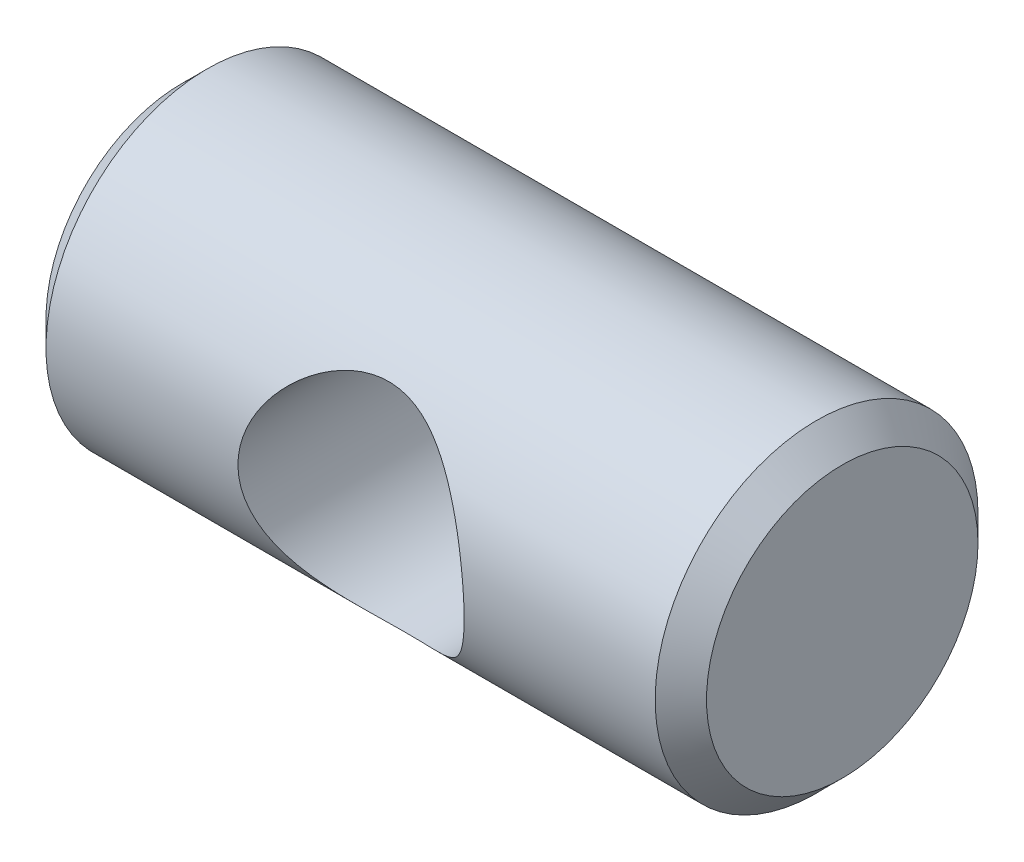
ISO-10303-21;
HEADER;
FILE_DESCRIPTION(('STEP AP214'),'2;1');
FILE_NAME('part.step','',(''),(''),'','','');
FILE_SCHEMA(('AUTOMOTIVE_DESIGN { 1 0 10303 214 1 1 1 1 }'));
ENDSEC;
DATA;
#1=APPLICATION_CONTEXT('core data for automotive mechanical design processes');
#2=APPLICATION_PROTOCOL_DEFINITION('international standard','automotive_design',2000,#1);
#3=PRODUCT_CONTEXT('',#1,'mechanical');
#4=PRODUCT('Part','Part','',(#3));
#5=PRODUCT_RELATED_PRODUCT_CATEGORY('part','',(#4));
#6=PRODUCT_DEFINITION_FORMATION('','',#4);
#7=PRODUCT_DEFINITION_CONTEXT('part definition',#1,'design');
#8=PRODUCT_DEFINITION('design','',#6,#7);
#9=PRODUCT_DEFINITION_SHAPE('','',#8);
#10=(LENGTH_UNIT() NAMED_UNIT(*) SI_UNIT(.MILLI.,.METRE.));
#11=(NAMED_UNIT(*) PLANE_ANGLE_UNIT() SI_UNIT($,.RADIAN.));
#12=(NAMED_UNIT(*) SI_UNIT($,.STERADIAN.) SOLID_ANGLE_UNIT());
#13=UNCERTAINTY_MEASURE_WITH_UNIT(LENGTH_MEASURE(1.E-05),#10,'distance_accuracy_value','');
#14=(GEOMETRIC_REPRESENTATION_CONTEXT(3) GLOBAL_UNCERTAINTY_ASSIGNED_CONTEXT((#13)) GLOBAL_UNIT_ASSIGNED_CONTEXT((#10,
#11,#12)) REPRESENTATION_CONTEXT('',''));
#15=CARTESIAN_POINT('',(0.,0.,0.));
#16=DIRECTION('',(0.,0.,1.));
#17=DIRECTION('',(1.,0.,0.));
#18=AXIS2_PLACEMENT_3D('',#15,#16,#17);
#19=CARTESIAN_POINT('',(9.78,0.,0.));
#20=DIRECTION('',(-1.,0.,0.));
#21=DIRECTION('',(0.,0.,1.));
#22=AXIS2_PLACEMENT_3D('',#19,#20,#21);
#23=CYLINDRICAL_SURFACE('',#22,4.78);
#24=CARTESIAN_POINT('',(9.01999999999999,0.,0.));
#25=DIRECTION('',(1.,0.,0.));
#26=DIRECTION('',(0.,0.,-1.));
#27=AXIS2_PLACEMENT_3D('',#24,#25,#26);
#28=CIRCLE('',#27,4.78);
#29=CARTESIAN_POINT('',(9.01999999999999,0.,-4.78));
#30=VERTEX_POINT('',#29);
#31=EDGE_CURVE('E46',#30,#30,#28,.F.);
#32=ORIENTED_EDGE('',*,*,#31,.T.);
#33=EDGE_LOOP('',(#32));
#34=FACE_BOUND('',#33,.T.);
#35=CARTESIAN_POINT('',(-9.02,0.,0.));
#36=DIRECTION('',(1.,0.,0.));
#37=DIRECTION('',(0.,0.,-1.));
#38=AXIS2_PLACEMENT_3D('',#35,#36,#37);
#39=CIRCLE('',#38,4.78);
#40=CARTESIAN_POINT('',(-9.02,0.,-4.78));
#41=VERTEX_POINT('',#40);
#42=EDGE_CURVE('E50',#41,#41,#39,.T.);
#43=ORIENTED_EDGE('',*,*,#42,.T.);
#44=EDGE_LOOP('',(#43));
#45=FACE_BOUND('',#44,.T.);
#46=CARTESIAN_POINT('',(-3.33063057092797,0.,-4.78));
#47=CARTESIAN_POINT('',(-3.33676539125167,-0.0817358571244511,-4.77999966649218));
#48=CARTESIAN_POINT('',(-3.33988802539212,-0.163703701049211,-4.77789885423811));
#49=CARTESIAN_POINT('',(-3.34010613153016,-0.327460768762198,-4.76947552132057));
#50=CARTESIAN_POINT('',(-3.33719898946377,-0.409249899685928,-4.76315117044975));
#51=CARTESIAN_POINT('',(-3.32543727495204,-0.572079528417738,-4.74634895090865));
#52=CARTESIAN_POINT('',(-3.31657497758107,-0.653118915073797,-4.73586569462154));
#53=CARTESIAN_POINT('',(-3.29308213176358,-0.813748659945501,-4.71092738722702));
#54=CARTESIAN_POINT('',(-3.27844914079353,-0.893338389631405,-4.69647065507882));
#55=CARTESIAN_POINT('',(-3.22643073348291,-1.12824247764658,-4.647672929024));
#56=CARTESIAN_POINT('',(-3.18084916567647,-1.2806904872149,-4.60779720472608));
#57=CARTESIAN_POINT('',(-3.07028481662123,-1.57424559019182,-4.51595969619237));
#58=CARTESIAN_POINT('',(-3.0053029126639,-1.71535319605217,-4.46399845849211));
#59=CARTESIAN_POINT('',(-2.8526700268856,-1.99505131544502,-4.34659893579363));
#60=CARTESIAN_POINT('',(-2.76364014223547,-2.13257506301559,-4.28042297967634));
#61=CARTESIAN_POINT('',(-2.5684551498314,-2.3912489751205,-4.14148987724878));
#62=CARTESIAN_POINT('',(-2.46228144838001,-2.51238109657793,-4.06872562352629));
#63=CARTESIAN_POINT('',(-2.21209856597161,-2.75978683966693,-3.90614354526028));
#64=CARTESIAN_POINT('',(-2.06475822393992,-2.88235195387562,-3.81579563949052));
#65=CARTESIAN_POINT('',(-1.74938343570631,-3.10169066112947,-3.63972808628516));
#66=CARTESIAN_POINT('',(-1.58135560321701,-3.1984724658577,-3.55400697222272));
#67=CARTESIAN_POINT('',(-1.27574248655582,-3.33994877544649,-3.42049304389891));
#68=CARTESIAN_POINT('',(-1.14309111475024,-3.39162881998858,-3.36884701872389));
#69=CARTESIAN_POINT('',(-0.868171214232621,-3.47839663166315,-3.27918654249491));
#70=CARTESIAN_POINT('',(-0.725925863936218,-3.51352285856917,-3.24114054446644));
#71=CARTESIAN_POINT('',(-0.456778401189836,-3.56098397003318,-3.18886561110929));
#72=CARTESIAN_POINT('',(-0.330905440225495,-3.57600341619245,-3.17186331778383));
#73=CARTESIAN_POINT('',(-0.0771522552904866,-3.59152153452207,-3.15428764860724));
#74=CARTESIAN_POINT('',(0.0507263323938594,-3.59203148454257,-3.15370151291364));
#75=CARTESIAN_POINT('',(0.304456273965372,-3.57851911488008,-3.16901974936269));
#76=CARTESIAN_POINT('',(0.430310477029117,-3.56451944553301,-3.18489841903175));
#77=CARTESIAN_POINT('',(0.677189681607818,-3.5230327215385,-3.23072346885153));
#78=CARTESIAN_POINT('',(0.798206706630149,-3.49552430904085,-3.26069212261029));
#79=CARTESIAN_POINT('',(1.08540616898222,-3.4136347105578,-3.34669387518232));
#80=CARTESIAN_POINT('',(1.24801209966346,-3.3527542502823,-3.4083932928103));
#81=CARTESIAN_POINT('',(1.55792869359016,-3.20934907091944,-3.54375745558097));
#82=CARTESIAN_POINT('',(1.7052093520615,-3.12678296760159,-3.61744497501507));
#83=CARTESIAN_POINT('',(1.98910473933941,-2.93868886474521,-3.77198471339833));
#84=CARTESIAN_POINT('',(2.12516086495379,-2.83245435836602,-3.85299789142044));
#85=CARTESIAN_POINT('',(2.37990031408984,-2.59976864472572,-4.0136756902919));
#86=CARTESIAN_POINT('',(2.49857675321568,-2.47330946739396,-4.09333976574748));
#87=CARTESIAN_POINT('',(2.67260294801087,-2.25590151469892,-4.21521400085458));
#88=CARTESIAN_POINT('',(2.73422627021433,-2.17112452936343,-4.25960231447671));
#89=CARTESIAN_POINT('',(2.84989416447087,-1.9949358869096,-4.34490468006992));
#90=CARTESIAN_POINT('',(2.90394239840893,-1.90352746816202,-4.38582040692994));
#91=CARTESIAN_POINT('',(3.00366613801331,-1.71457474641946,-4.46307423584665));
#92=CARTESIAN_POINT('',(3.0493529108607,-1.61703894195848,-4.4994184770652));
#93=CARTESIAN_POINT('',(3.13158315679104,-1.41642298219572,-4.5665458260388));
#94=CARTESIAN_POINT('',(3.16813138282885,-1.31334574302932,-4.59733182230953));
#95=CARTESIAN_POINT('',(3.24394962180977,-1.06003125309359,-4.66347569287104));
#96=CARTESIAN_POINT('',(3.27842046935922,-0.907475950560133,-4.69570617232902));
#97=CARTESIAN_POINT('',(3.32565961796539,-0.596778113212414,-4.74520584581533));
#98=CARTESIAN_POINT('',(3.338446274403,-0.438640419702783,-4.76248768758954));
#99=CARTESIAN_POINT('',(3.34128849208833,-0.120886806893837,-4.7811242764666));
#100=CARTESIAN_POINT('',(3.33129991792253,0.0387313845776097,-4.78244806771143));
#101=CARTESIAN_POINT('',(3.28873988258478,0.354282081348732,-4.7694700869775));
#102=CARTESIAN_POINT('',(3.25616176280358,0.510213485894268,-4.75516370705414));
#103=CARTESIAN_POINT('',(3.17086453501599,0.810704954450435,-4.71314049829326));
#104=CARTESIAN_POINT('',(3.1186042550631,0.955439708476959,-4.68572559661454));
#105=CARTESIAN_POINT('',(2.99593886064011,1.23431167329955,-4.62011068482161));
#106=CARTESIAN_POINT('',(2.92553031538523,1.36844687406345,-4.58190863535263));
#107=CARTESIAN_POINT('',(2.76002097373168,1.63828679943511,-4.492967209277));
#108=CARTESIAN_POINT('',(2.66305574100992,1.77254043082908,-4.44131086725188));
#109=CARTESIAN_POINT('',(2.45171752361612,2.02414370296862,-4.33244486650996));
#110=CARTESIAN_POINT('',(2.3373245604925,2.14147363865188,-4.27522886203756));
#111=CARTESIAN_POINT('',(2.07299005839493,2.37572113568635,-4.15026480188048));
#112=CARTESIAN_POINT('',(1.92029399278101,2.48944143866722,-4.08232286530849));
#113=CARTESIAN_POINT('',(1.5958110081242,2.6902949710491,-3.95284550398233));
#114=CARTESIAN_POINT('',(1.42403601749138,2.7774446865133,-3.89130612236076));
#115=CARTESIAN_POINT('',(1.10291786857647,2.90629975005956,-3.79563172198653));
#116=CARTESIAN_POINT('',(0.956810766472338,2.95376492454212,-3.75844758867047));
#117=CARTESIAN_POINT('',(0.656746344994096,3.02842866265348,-3.69855983762439));
#118=CARTESIAN_POINT('',(0.502803284869111,3.05566272514491,-3.67583086603468));
#119=CARTESIAN_POINT('',(0.189971842970665,3.0883167381648,-3.64845182308364));
#120=CARTESIAN_POINT('',(0.0310589379063212,3.09360199426155,-3.64391338848103));
#121=CARTESIAN_POINT('',(-0.285320807227747,3.08155724848054,-3.65410060934482));
#122=CARTESIAN_POINT('',(-0.442786963320062,3.06421705346061,-3.66883494752337));
#123=CARTESIAN_POINT('',(-0.738261126757475,3.01055950683524,-3.71294731262674));
#124=CARTESIAN_POINT('',(-0.876794901379663,2.97595113702564,-3.74099713164187));
#125=CARTESIAN_POINT('',(-1.14605004225745,2.89040561941312,-3.80747678017108));
#126=CARTESIAN_POINT('',(-1.27676821176829,2.83946184356998,-3.84591082205324));
#127=CARTESIAN_POINT('',(-1.54991112838108,2.71304301772115,-3.93633973232228));
#128=CARTESIAN_POINT('',(-1.69070272193468,2.63490579658652,-3.98952593455585));
#129=CARTESIAN_POINT('',(-1.95874606705629,2.46008514214848,-4.09964382375276));
#130=CARTESIAN_POINT('',(-2.08598297013024,2.36338168877894,-4.15657950986317));
#131=CARTESIAN_POINT('',(-2.35108322428361,2.13021246005196,-4.28153903185377));
#132=CARTESIAN_POINT('',(-2.48549057542721,1.989663038697,-4.34935756817831));
#133=CARTESIAN_POINT('',(-2.72941983025129,1.68491592342699,-4.47623416677492));
#134=CARTESIAN_POINT('',(-2.83895382859404,1.52072978659437,-4.5352964818867));
#135=CARTESIAN_POINT('',(-3.01103475904863,1.20439767138347,-4.62813420989487));
#136=CARTESIAN_POINT('',(-3.07854051609877,1.05576260710862,-4.66457427100285));
#137=CARTESIAN_POINT('',(-3.16330947156953,0.82507814344574,-4.70890599331024));
#138=CARTESIAN_POINT('',(-3.1888041083791,0.746958270624455,-4.72195570943659));
#139=CARTESIAN_POINT('',(-3.23406573379647,0.588564271004288,-4.74429907021986));
#140=CARTESIAN_POINT('',(-3.25383526621185,0.508291118338657,-4.75359438377901));
#141=CARTESIAN_POINT('',(-3.28517308849838,0.356952498058561,-4.76717604384205));
#142=CARTESIAN_POINT('',(-3.29748287716603,0.286084166525628,-4.77196453484361));
#143=CARTESIAN_POINT('',(-3.31751555245762,0.143537141372693,-4.77837710995417));
#144=CARTESIAN_POINT('',(-3.3252371328246,0.0718582228926744,-4.78000029320399));
#145=CARTESIAN_POINT('',(-3.33063057092797,0.,-4.78));
#146=B_SPLINE_CURVE_WITH_KNOTS('',3,(#46,#47,#48,#49,#50,#51,#52,#53,#54,#55,#56,#57,#58,#59,
#60,#61,#62,#63,#64,#65,#66,#67,#68,#69,#70,#71,#72,#73,#74,#75,#76,#77,#78,#79,#80,#81,#82,#83,
#84,#85,#86,#87,#88,#89,#90,#91,#92,#93,#94,#95,#96,#97,#98,#99,#100,#101,#102,#103,#104,#105,
#106,#107,#108,#109,#110,#111,#112,#113,#114,#115,#116,#117,#118,#119,#120,#121,#122,#123,#124,
#125,#126,#127,#128,#129,#130,#131,#132,#133,#134,#135,#136,#137,#138,#139,#140,#141,#142,#143,
#144,#145),.UNSPECIFIED.,.T.,.F.,(4,2,2,2,2,2,2,2,2,2,2,2,2,2,2,2,2,2,2,2,2,2,2,2,2,2,2,2,2,2,2,
2,2,2,2,2,2,2,2,2,2,2,2,2,2,2,2,2,2,4),(0.,0.245824100276611,0.491754793935409,
0.738005122109381,0.984359791100692,1.47408641984102,1.96379090628794,2.49192992683938,
3.0206456477113,3.65377088568753,4.28669423894782,4.73960333216678,5.1914549220684,
5.57342837523144,5.95510492234758,6.3361865469179,6.71787262567725,7.26762740616682,
7.81843904291118,8.3886569429409,8.9591001087531,9.30013321817021,9.64100089539176,
9.98140581147174,10.3216333130821,10.7984660737602,11.2748949999681,11.7522479675101,
12.2297417018871,12.6967314925483,13.1638096287332,13.6822781424451,14.2013455431729,
14.8051912989707,15.4086616248264,15.8810047798169,16.3525171594496,16.8269188572968,
17.3015343548139,17.7364437600122,18.1715298521164,18.6784872655248,19.1859944356092,
19.8009790838485,20.4156640525465,20.9151418307943,21.164494138307,21.4137354817391,
21.6297906916855,21.8459073828357),.UNSPECIFIED.);
#147=CARTESIAN_POINT('',(-3.33063057092797,0.,-4.78));
#148=VERTEX_POINT('',#147);
#149=EDGE_CURVE('E59',#148,#148,#146,.T.);
#150=ORIENTED_EDGE('',*,*,#149,.T.);
#151=EDGE_LOOP('',(#150));
#152=FACE_BOUND('',#151,.T.);
#153=CARTESIAN_POINT('',(3.33063057092797,0.,4.78));
#154=CARTESIAN_POINT('',(3.33676539125167,-0.0817358571244511,4.77999966649218));
#155=CARTESIAN_POINT('',(3.33988802539212,-0.163703701049211,4.77789885423811));
#156=CARTESIAN_POINT('',(3.34010613153016,-0.327460768762198,4.76947552132057));
#157=CARTESIAN_POINT('',(3.33719898946377,-0.409249899685928,4.76315117044975));
#158=CARTESIAN_POINT('',(3.32543727495204,-0.572079528417738,4.74634895090865));
#159=CARTESIAN_POINT('',(3.31657497758107,-0.653118915073797,4.73586569462154));
#160=CARTESIAN_POINT('',(3.29308213176358,-0.813748659945501,4.71092738722702));
#161=CARTESIAN_POINT('',(3.27844914079353,-0.893338389631405,4.69647065507882));
#162=CARTESIAN_POINT('',(3.22643073348291,-1.12824247764658,4.647672929024));
#163=CARTESIAN_POINT('',(3.18084916567647,-1.2806904872149,4.60779720472608));
#164=CARTESIAN_POINT('',(3.07028481662123,-1.57424559019182,4.51595969619237));
#165=CARTESIAN_POINT('',(3.0053029126639,-1.71535319605217,4.46399845849211));
#166=CARTESIAN_POINT('',(2.8526700268856,-1.99505131544502,4.34659893579363));
#167=CARTESIAN_POINT('',(2.76364014223547,-2.13257506301559,4.28042297967634));
#168=CARTESIAN_POINT('',(2.5684551498314,-2.3912489751205,4.14148987724878));
#169=CARTESIAN_POINT('',(2.46228144838001,-2.51238109657793,4.06872562352629));
#170=CARTESIAN_POINT('',(2.21209856597161,-2.75978683966693,3.90614354526028));
#171=CARTESIAN_POINT('',(2.06475822393992,-2.88235195387562,3.81579563949052));
#172=CARTESIAN_POINT('',(1.74938343570631,-3.10169066112947,3.63972808628516));
#173=CARTESIAN_POINT('',(1.58135560321701,-3.1984724658577,3.55400697222272));
#174=CARTESIAN_POINT('',(1.27574248655582,-3.33994877544649,3.42049304389891));
#175=CARTESIAN_POINT('',(1.14309111475024,-3.39162881998858,3.36884701872389));
#176=CARTESIAN_POINT('',(0.868171214232621,-3.47839663166315,3.27918654249491));
#177=CARTESIAN_POINT('',(0.725925863936218,-3.51352285856917,3.24114054446644));
#178=CARTESIAN_POINT('',(0.456778401189836,-3.56098397003318,3.18886561110929));
#179=CARTESIAN_POINT('',(0.330905440225495,-3.57600341619245,3.17186331778383));
#180=CARTESIAN_POINT('',(0.0771522552904866,-3.59152153452207,3.15428764860724));
#181=CARTESIAN_POINT('',(-0.0507263323938594,-3.59203148454257,3.15370151291364));
#182=CARTESIAN_POINT('',(-0.304456273965372,-3.57851911488008,3.16901974936269));
#183=CARTESIAN_POINT('',(-0.430310477029117,-3.56451944553301,3.18489841903175));
#184=CARTESIAN_POINT('',(-0.677189681607818,-3.5230327215385,3.23072346885153));
#185=CARTESIAN_POINT('',(-0.798206706630149,-3.49552430904085,3.26069212261029));
#186=CARTESIAN_POINT('',(-1.08540616898222,-3.4136347105578,3.34669387518232));
#187=CARTESIAN_POINT('',(-1.24801209966346,-3.3527542502823,3.4083932928103));
#188=CARTESIAN_POINT('',(-1.55792869359016,-3.20934907091944,3.54375745558097));
#189=CARTESIAN_POINT('',(-1.7052093520615,-3.12678296760159,3.61744497501507));
#190=CARTESIAN_POINT('',(-1.98910473933941,-2.93868886474521,3.77198471339833));
#191=CARTESIAN_POINT('',(-2.12516086495379,-2.83245435836602,3.85299789142044));
#192=CARTESIAN_POINT('',(-2.37990031408984,-2.59976864472572,4.0136756902919));
#193=CARTESIAN_POINT('',(-2.49857675321568,-2.47330946739396,4.09333976574748));
#194=CARTESIAN_POINT('',(-2.67260294801087,-2.25590151469892,4.21521400085458));
#195=CARTESIAN_POINT('',(-2.73422627021433,-2.17112452936343,4.25960231447671));
#196=CARTESIAN_POINT('',(-2.84989416447087,-1.9949358869096,4.34490468006992));
#197=CARTESIAN_POINT('',(-2.90394239840893,-1.90352746816202,4.38582040692994));
#198=CARTESIAN_POINT('',(-3.00366613801331,-1.71457474641946,4.46307423584665));
#199=CARTESIAN_POINT('',(-3.0493529108607,-1.61703894195848,4.4994184770652));
#200=CARTESIAN_POINT('',(-3.13158315679104,-1.41642298219572,4.5665458260388));
#201=CARTESIAN_POINT('',(-3.16813138282885,-1.31334574302932,4.59733182230953));
#202=CARTESIAN_POINT('',(-3.24394962180977,-1.06003125309359,4.66347569287104));
#203=CARTESIAN_POINT('',(-3.27842046935922,-0.907475950560133,4.69570617232902));
#204=CARTESIAN_POINT('',(-3.32565961796539,-0.596778113212414,4.74520584581533));
#205=CARTESIAN_POINT('',(-3.338446274403,-0.438640419702783,4.76248768758954));
#206=CARTESIAN_POINT('',(-3.34128849208833,-0.120886806893837,4.7811242764666));
#207=CARTESIAN_POINT('',(-3.33129991792253,0.0387313845776097,4.78244806771143));
#208=CARTESIAN_POINT('',(-3.28873988258478,0.354282081348732,4.7694700869775));
#209=CARTESIAN_POINT('',(-3.25616176280358,0.510213485894268,4.75516370705414));
#210=CARTESIAN_POINT('',(-3.17086453501599,0.810704954450435,4.71314049829326));
#211=CARTESIAN_POINT('',(-3.1186042550631,0.955439708476959,4.68572559661454));
#212=CARTESIAN_POINT('',(-2.99593886064011,1.23431167329955,4.62011068482161));
#213=CARTESIAN_POINT('',(-2.92553031538523,1.36844687406345,4.58190863535263));
#214=CARTESIAN_POINT('',(-2.76002097373168,1.63828679943511,4.492967209277));
#215=CARTESIAN_POINT('',(-2.66305574100992,1.77254043082908,4.44131086725188));
#216=CARTESIAN_POINT('',(-2.45171752361612,2.02414370296862,4.33244486650996));
#217=CARTESIAN_POINT('',(-2.3373245604925,2.14147363865188,4.27522886203756));
#218=CARTESIAN_POINT('',(-2.07299005839493,2.37572113568635,4.15026480188048));
#219=CARTESIAN_POINT('',(-1.92029399278101,2.48944143866722,4.08232286530849));
#220=CARTESIAN_POINT('',(-1.5958110081242,2.6902949710491,3.95284550398233));
#221=CARTESIAN_POINT('',(-1.42403601749138,2.7774446865133,3.89130612236076));
#222=CARTESIAN_POINT('',(-1.10291786857647,2.90629975005956,3.79563172198653));
#223=CARTESIAN_POINT('',(-0.956810766472338,2.95376492454212,3.75844758867047));
#224=CARTESIAN_POINT('',(-0.656746344994096,3.02842866265348,3.69855983762439));
#225=CARTESIAN_POINT('',(-0.502803284869111,3.05566272514491,3.67583086603468));
#226=CARTESIAN_POINT('',(-0.189971842970665,3.0883167381648,3.64845182308364));
#227=CARTESIAN_POINT('',(-0.0310589379063212,3.09360199426155,3.64391338848103));
#228=CARTESIAN_POINT('',(0.285320807227747,3.08155724848054,3.65410060934482));
#229=CARTESIAN_POINT('',(0.442786963320062,3.06421705346061,3.66883494752337));
#230=CARTESIAN_POINT('',(0.738261126757475,3.01055950683524,3.71294731262674));
#231=CARTESIAN_POINT('',(0.876794901379663,2.97595113702564,3.74099713164187));
#232=CARTESIAN_POINT('',(1.14605004225745,2.89040561941312,3.80747678017108));
#233=CARTESIAN_POINT('',(1.27676821176829,2.83946184356998,3.84591082205324));
#234=CARTESIAN_POINT('',(1.54991112838108,2.71304301772115,3.93633973232228));
#235=CARTESIAN_POINT('',(1.69070272193468,2.63490579658652,3.98952593455585));
#236=CARTESIAN_POINT('',(1.95874606705629,2.46008514214848,4.09964382375276));
#237=CARTESIAN_POINT('',(2.08598297013024,2.36338168877894,4.15657950986317));
#238=CARTESIAN_POINT('',(2.35108322428361,2.13021246005196,4.28153903185377));
#239=CARTESIAN_POINT('',(2.48549057542721,1.989663038697,4.34935756817831));
#240=CARTESIAN_POINT('',(2.72941983025129,1.68491592342699,4.47623416677492));
#241=CARTESIAN_POINT('',(2.83895382859404,1.52072978659437,4.5352964818867));
#242=CARTESIAN_POINT('',(3.01103475904863,1.20439767138347,4.62813420989487));
#243=CARTESIAN_POINT('',(3.07854051609877,1.05576260710862,4.66457427100285));
#244=CARTESIAN_POINT('',(3.16330947156953,0.82507814344574,4.70890599331024));
#245=CARTESIAN_POINT('',(3.1888041083791,0.746958270624455,4.72195570943659));
#246=CARTESIAN_POINT('',(3.23406573379647,0.588564271004288,4.74429907021986));
#247=CARTESIAN_POINT('',(3.25383526621185,0.508291118338657,4.75359438377901));
#248=CARTESIAN_POINT('',(3.28517308849838,0.356952498058561,4.76717604384205));
#249=CARTESIAN_POINT('',(3.29748287716603,0.286084166525628,4.77196453484361));
#250=CARTESIAN_POINT('',(3.31751555245762,0.143537141372693,4.77837710995417));
#251=CARTESIAN_POINT('',(3.3252371328246,0.0718582228926744,4.78000029320399));
#252=CARTESIAN_POINT('',(3.33063057092797,0.,4.78));
#253=B_SPLINE_CURVE_WITH_KNOTS('',3,(#153,#154,#155,#156,#157,#158,#159,#160,#161,#162,#163,
#164,#165,#166,#167,#168,#169,#170,#171,#172,#173,#174,#175,#176,#177,#178,#179,#180,#181,#182,
#183,#184,#185,#186,#187,#188,#189,#190,#191,#192,#193,#194,#195,#196,#197,#198,#199,#200,#201,
#202,#203,#204,#205,#206,#207,#208,#209,#210,#211,#212,#213,#214,#215,#216,#217,#218,#219,#220,
#221,#222,#223,#224,#225,#226,#227,#228,#229,#230,#231,#232,#233,#234,#235,#236,#237,#238,#239,
#240,#241,#242,#243,#244,#245,#246,#247,#248,#249,#250,#251,#252),.UNSPECIFIED.,.T.,.F.,(4,2,2,
2,2,2,2,2,2,2,2,2,2,2,2,2,2,2,2,2,2,2,2,2,2,2,2,2,2,2,2,2,2,2,2,2,2,2,2,2,2,2,2,2,2,2,2,2,2,4),
(0.,0.245824100276611,0.491754793935409,0.738005122109381,0.984359791100692,1.47408641984102,
1.96379090628794,2.49192992683938,3.0206456477113,3.65377088568753,4.28669423894782,
4.73960333216678,5.1914549220684,5.57342837523144,5.95510492234758,6.3361865469179,
6.71787262567725,7.26762740616682,7.81843904291118,8.3886569429409,8.9591001087531,
9.30013321817021,9.64100089539176,9.98140581147174,10.3216333130821,10.7984660737602,
11.2748949999681,11.7522479675101,12.2297417018871,12.6967314925483,13.1638096287332,
13.6822781424451,14.2013455431729,14.8051912989707,15.4086616248264,15.8810047798169,
16.3525171594496,16.8269188572968,17.3015343548139,17.7364437600122,18.1715298521164,
18.6784872655248,19.1859944356092,19.8009790838485,20.4156640525465,20.9151418307943,
21.164494138307,21.4137354817391,21.6297906916855,21.8459073828357),.UNSPECIFIED.);
#254=CARTESIAN_POINT('',(3.33063057092797,0.,4.78));
#255=VERTEX_POINT('',#254);
#256=EDGE_CURVE('E67',#255,#255,#253,.T.);
#257=ORIENTED_EDGE('',*,*,#256,.T.);
#258=EDGE_LOOP('',(#257));
#259=FACE_BOUND('',#258,.T.);
#260=ADVANCED_FACE('F38',(#34,#45,#152,#259),#23,.T.);
#261=CARTESIAN_POINT('',(9.78,0.,0.));
#262=DIRECTION('',(1.,0.,0.));
#263=DIRECTION('',(0.,0.,-1.));
#264=AXIS2_PLACEMENT_3D('',#261,#262,#263);
#265=PLANE('',#264);
#266=CARTESIAN_POINT('',(9.78,0.,0.));
#267=DIRECTION('',(1.,0.,0.));
#268=DIRECTION('',(0.,0.,-1.));
#269=AXIS2_PLACEMENT_3D('',#266,#267,#268);
#270=CIRCLE('',#269,4.01999999999999);
#271=CARTESIAN_POINT('',(9.78,0.,-4.01999999999999));
#272=VERTEX_POINT('',#271);
#273=EDGE_CURVE('E54',#272,#272,#270,.T.);
#274=ORIENTED_EDGE('',*,*,#273,.T.);
#275=EDGE_LOOP('',(#274));
#276=FACE_BOUND('',#275,.T.);
#277=ADVANCED_FACE('F80',(#276),#265,.T.);
#278=CARTESIAN_POINT('',(-9.78,0.,0.));
#279=DIRECTION('',(1.,0.,0.));
#280=DIRECTION('',(0.,0.,-1.));
#281=AXIS2_PLACEMENT_3D('',#278,#279,#280);
#282=PLANE('',#281);
#283=CARTESIAN_POINT('',(-9.78,0.,0.));
#284=DIRECTION('',(1.,0.,0.));
#285=DIRECTION('',(0.,0.,-1.));
#286=AXIS2_PLACEMENT_3D('',#283,#284,#285);
#287=CIRCLE('',#286,4.02);
#288=CARTESIAN_POINT('',(-9.78,0.,-4.02));
#289=VERTEX_POINT('',#288);
#290=EDGE_CURVE('E10',#289,#289,#287,.F.);
#291=ORIENTED_EDGE('',*,*,#290,.T.);
#292=EDGE_LOOP('',(#291));
#293=FACE_BOUND('',#292,.T.);
#294=ADVANCED_FACE('F78',(#293),#282,.F.);
#295=CARTESIAN_POINT('',(0.,-0.25,-4.78));
#296=DIRECTION('',(0.,0.,1.));
#297=DIRECTION('',(1.,0.,0.));
#298=AXIS2_PLACEMENT_3D('',#295,#296,#297);
#299=CYLINDRICAL_SURFACE('',#298,3.34);
#300=ORIENTED_EDGE('',*,*,#149,.F.);
#301=EDGE_LOOP('',(#300));
#302=FACE_BOUND('',#301,.T.);
#303=ORIENTED_EDGE('',*,*,#256,.F.);
#304=EDGE_LOOP('',(#303));
#305=FACE_BOUND('',#304,.T.);
#306=ADVANCED_FACE('F73',(#302,#305),#299,.F.);
#307=CARTESIAN_POINT('',(9.78,0.,0.));
#308=DIRECTION('',(-1.,0.,0.));
#309=DIRECTION('',(0.,0.,1.));
#310=AXIS2_PLACEMENT_3D('',#307,#308,#309);
#311=CONICAL_SURFACE('',#310,4.01999999999999,0.785398163397449);
#312=ORIENTED_EDGE('',*,*,#31,.F.);
#313=EDGE_LOOP('',(#312));
#314=FACE_BOUND('',#313,.T.);
#315=ORIENTED_EDGE('',*,*,#273,.F.);
#316=EDGE_LOOP('',(#315));
#317=FACE_BOUND('',#316,.T.);
#318=ADVANCED_FACE('F77',(#314,#317),#311,.T.);
#319=CARTESIAN_POINT('',(-9.02,0.,0.));
#320=DIRECTION('',(1.,0.,0.));
#321=DIRECTION('',(0.,0.,-1.));
#322=AXIS2_PLACEMENT_3D('',#319,#320,#321);
#323=CONICAL_SURFACE('',#322,4.78,0.785398163397449);
#324=ORIENTED_EDGE('',*,*,#290,.F.);
#325=EDGE_LOOP('',(#324));
#326=FACE_BOUND('',#325,.T.);
#327=ORIENTED_EDGE('',*,*,#42,.F.);
#328=EDGE_LOOP('',(#327));
#329=FACE_BOUND('',#328,.T.);
#330=ADVANCED_FACE('F41',(#326,#329),#323,.T.);
#331=CLOSED_SHELL('',(#260,#277,#294,#306,#318,#330));
#332=MANIFOLD_SOLID_BREP('B2',#331);
#333=ADVANCED_BREP_SHAPE_REPRESENTATION('',(#18,#332),#14);
#334=SHAPE_DEFINITION_REPRESENTATION(#9,#333);
ENDSEC;
END-ISO-10303-21;
